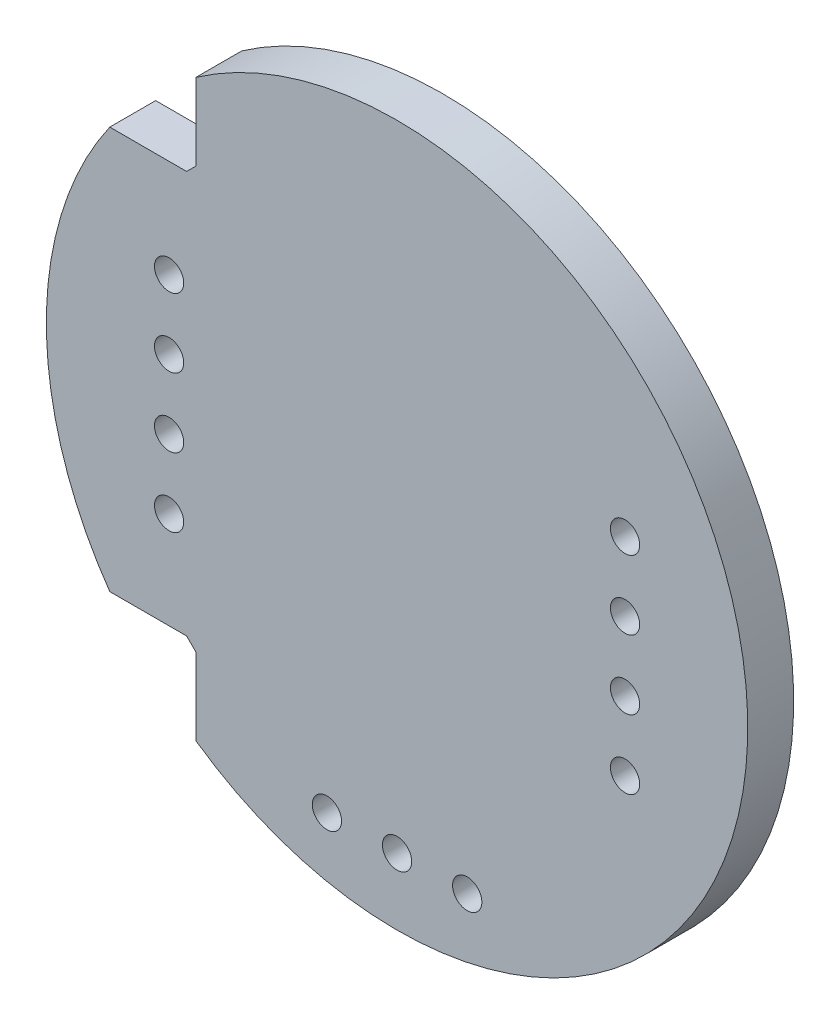
ISO-10303-21;
HEADER;
FILE_DESCRIPTION(('STEP AP214'),'2;1');
FILE_NAME('part.step','',(''),(''),'','','');
FILE_SCHEMA(('AUTOMOTIVE_DESIGN { 1 0 10303 214 1 1 1 1 }'));
ENDSEC;
DATA;
#1=APPLICATION_CONTEXT('core data for automotive mechanical design processes');
#2=APPLICATION_PROTOCOL_DEFINITION('international standard','automotive_design',2000,#1);
#3=PRODUCT_CONTEXT('',#1,'mechanical');
#4=PRODUCT('Part','Part','',(#3));
#5=PRODUCT_RELATED_PRODUCT_CATEGORY('part','',(#4));
#6=PRODUCT_DEFINITION_FORMATION('','',#4);
#7=PRODUCT_DEFINITION_CONTEXT('part definition',#1,'design');
#8=PRODUCT_DEFINITION('design','',#6,#7);
#9=PRODUCT_DEFINITION_SHAPE('','',#8);
#10=(LENGTH_UNIT() NAMED_UNIT(*) SI_UNIT(.MILLI.,.METRE.));
#11=(NAMED_UNIT(*) PLANE_ANGLE_UNIT() SI_UNIT($,.RADIAN.));
#12=(NAMED_UNIT(*) SI_UNIT($,.STERADIAN.) SOLID_ANGLE_UNIT());
#13=UNCERTAINTY_MEASURE_WITH_UNIT(LENGTH_MEASURE(1.E-05),#10,'distance_accuracy_value','');
#14=(GEOMETRIC_REPRESENTATION_CONTEXT(3) GLOBAL_UNCERTAINTY_ASSIGNED_CONTEXT((#13)) GLOBAL_UNIT_ASSIGNED_CONTEXT((#10,
#11,#12)) REPRESENTATION_CONTEXT('',''));
#15=CARTESIAN_POINT('',(0.,0.,0.));
#16=DIRECTION('',(0.,0.,1.));
#17=DIRECTION('',(1.,0.,0.));
#18=AXIS2_PLACEMENT_3D('',#15,#16,#17);
#19=CARTESIAN_POINT('',(17.780000686646,18.115999221802,0.));
#20=DIRECTION('',(0.707106781186548,0.707106781186548,0.));
#21=DIRECTION('',(-0.707106781186548,0.707106781186548,0.));
#22=AXIS2_PLACEMENT_3D('',#19,#20,#21);
#23=PLANE('',#22);
#24=DIRECTION('',(0.,0.,-1.));
#25=VECTOR('',#24,1.);
#26=CARTESIAN_POINT('',(18.115999221802,17.780000686646,0.));
#27=LINE('',#26,#25);
#28=CARTESIAN_POINT('',(18.115999221802,17.780000686646,0.));
#29=VERTEX_POINT('',#28);
#30=CARTESIAN_POINT('',(18.115999221802,17.780000686646,1.6614394));
#31=VERTEX_POINT('',#30);
#32=EDGE_CURVE('E92',#29,#31,#27,.F.);
#33=ORIENTED_EDGE('',*,*,#32,.T.);
#34=DIRECTION('',(0.707106781186548,-0.707106781186548,0.));
#35=VECTOR('',#34,1.);
#36=CARTESIAN_POINT('',(17.780000686646,18.115999221802,1.6614394));
#37=LINE('',#36,#35);
#38=CARTESIAN_POINT('',(17.780000686646,18.115999221802,1.6614394));
#39=VERTEX_POINT('',#38);
#40=EDGE_CURVE('E77',#39,#31,#37,.T.);
#41=ORIENTED_EDGE('',*,*,#40,.F.);
#42=DIRECTION('',(0.,0.,1.));
#43=VECTOR('',#42,1.);
#44=CARTESIAN_POINT('',(17.780000686646,18.115999221802,0.));
#45=LINE('',#44,#43);
#46=CARTESIAN_POINT('',(17.780000686646,18.115999221802,0.));
#47=VERTEX_POINT('',#46);
#48=EDGE_CURVE('E94',#39,#47,#45,.F.);
#49=ORIENTED_EDGE('',*,*,#48,.T.);
#50=DIRECTION('',(-0.707106781186548,0.707106781186548,0.));
#51=VECTOR('',#50,1.);
#52=CARTESIAN_POINT('',(17.780000686646,18.115999221802,0.));
#53=LINE('',#52,#51);
#54=EDGE_CURVE('E87',#29,#47,#53,.T.);
#55=ORIENTED_EDGE('',*,*,#54,.F.);
#56=EDGE_LOOP('',(#33,#41,#49,#55));
#57=FACE_BOUND('',#56,.T.);
#58=ADVANCED_FACE('F17',(#57),#23,.F.);
#59=CARTESIAN_POINT('',(18.115999221802,33.020000457764,0.));
#60=DIRECTION('',(0.707110795155155,-0.707102767195155,0.));
#61=DIRECTION('',(0.707102767195155,0.707110795155155,0.));
#62=AXIS2_PLACEMENT_3D('',#59,#60,#61);
#63=PLANE('',#62);
#64=DIRECTION('',(0.,0.,-1.));
#65=VECTOR('',#64,1.);
#66=CARTESIAN_POINT('',(17.780000686646,32.68399810791,0.));
#67=LINE('',#66,#65);
#68=CARTESIAN_POINT('',(17.7800006866458,32.6839981079102,0.));
#69=VERTEX_POINT('',#68);
#70=CARTESIAN_POINT('',(17.780000686646,32.68399810791,1.6614394));
#71=VERTEX_POINT('',#70);
#72=EDGE_CURVE('E132',#69,#71,#67,.F.);
#73=ORIENTED_EDGE('',*,*,#72,.T.);
#74=DIRECTION('',(-0.707102767194094,-0.707110795156215,0.));
#75=VECTOR('',#74,1.);
#76=CARTESIAN_POINT('',(18.115999221802,33.020000457764,1.6614394));
#77=LINE('',#76,#75);
#78=CARTESIAN_POINT('',(18.115999221802,33.020000457764,1.6614394));
#79=VERTEX_POINT('',#78);
#80=EDGE_CURVE('E158',#79,#71,#77,.T.);
#81=ORIENTED_EDGE('',*,*,#80,.F.);
#82=DIRECTION('',(0.,0.,-1.));
#83=VECTOR('',#82,1.);
#84=CARTESIAN_POINT('',(18.115999221802,33.020000457764,0.));
#85=LINE('',#84,#83);
#86=CARTESIAN_POINT('',(18.115999221802,33.020000457764,0.));
#87=VERTEX_POINT('',#86);
#88=EDGE_CURVE('E135',#79,#87,#85,.T.);
#89=ORIENTED_EDGE('',*,*,#88,.T.);
#90=DIRECTION('',(0.707102767195155,0.707110795155155,0.));
#91=VECTOR('',#90,1.);
#92=CARTESIAN_POINT('',(18.115999221802,33.020000457764,0.));
#93=LINE('',#92,#91);
#94=EDGE_CURVE('E96',#69,#87,#93,.T.);
#95=ORIENTED_EDGE('',*,*,#94,.F.);
#96=EDGE_LOOP('',(#73,#81,#89,#95));
#97=FACE_BOUND('',#96,.T.);
#98=ADVANCED_FACE('F441',(#97),#63,.F.);
#99=CARTESIAN_POINT('',(14.996999740601,18.115999221802,1.6614394));
#100=DIRECTION('',(0.,0.,1.));
#101=DIRECTION('',(1.,0.,0.));
#102=AXIS2_PLACEMENT_3D('',#99,#100,#101);
#103=PLANE('',#102);
#104=CARTESIAN_POINT('',(33.655,26.67,1.6614394));
#105=DIRECTION('',(0.,0.,-1.));
#106=DIRECTION('',(-1.,0.,0.));
#107=AXIS2_PLACEMENT_3D('',#104,#105,#106);
#108=CIRCLE('',#107,0.53);
#109=CARTESIAN_POINT('',(33.125,26.67,1.6614394));
#110=VERTEX_POINT('',#109);
#111=EDGE_CURVE('E115',#110,#110,#108,.T.);
#112=ORIENTED_EDGE('',*,*,#111,.T.);
#113=EDGE_LOOP('',(#112));
#114=FACE_BOUND('',#113,.T.);
#115=CARTESIAN_POINT('',(33.655,24.17,1.6614394));
#116=DIRECTION('',(0.,0.,-1.));
#117=DIRECTION('',(-1.,0.,0.));
#118=AXIS2_PLACEMENT_3D('',#115,#116,#117);
#119=CIRCLE('',#118,0.53);
#120=CARTESIAN_POINT('',(33.125,24.17,1.6614394));
#121=VERTEX_POINT('',#120);
#122=EDGE_CURVE('E213',#121,#121,#119,.T.);
#123=ORIENTED_EDGE('',*,*,#122,.T.);
#124=EDGE_LOOP('',(#123));
#125=FACE_BOUND('',#124,.T.);
#126=CARTESIAN_POINT('',(33.655,29.17,1.6614394));
#127=DIRECTION('',(0.,0.,-1.));
#128=DIRECTION('',(-1.,0.,0.));
#129=AXIS2_PLACEMENT_3D('',#126,#127,#128);
#130=CIRCLE('',#129,0.53);
#131=CARTESIAN_POINT('',(33.125,29.17,1.6614394));
#132=VERTEX_POINT('',#131);
#133=EDGE_CURVE('E216',#132,#132,#130,.T.);
#134=ORIENTED_EDGE('',*,*,#133,.T.);
#135=EDGE_LOOP('',(#134));
#136=FACE_BOUND('',#135,.T.);
#137=CARTESIAN_POINT('',(33.655,21.67,1.6614394));
#138=DIRECTION('',(0.,0.,-1.));
#139=DIRECTION('',(-1.,0.,0.));
#140=AXIS2_PLACEMENT_3D('',#137,#138,#139);
#141=CIRCLE('',#140,0.53);
#142=CARTESIAN_POINT('',(33.125,21.67,1.6614394));
#143=VERTEX_POINT('',#142);
#144=EDGE_CURVE('E219',#143,#143,#141,.T.);
#145=ORIENTED_EDGE('',*,*,#144,.T.);
#146=EDGE_LOOP('',(#145));
#147=FACE_BOUND('',#146,.T.);
#148=CARTESIAN_POINT('',(27.94,15.113,1.6614394));
#149=DIRECTION('',(0.,0.,-1.));
#150=DIRECTION('',(-1.,0.,0.));
#151=AXIS2_PLACEMENT_3D('',#148,#149,#150);
#152=CIRCLE('',#151,0.53);
#153=CARTESIAN_POINT('',(27.41,15.113,1.6614394));
#154=VERTEX_POINT('',#153);
#155=EDGE_CURVE('E222',#154,#154,#152,.T.);
#156=ORIENTED_EDGE('',*,*,#155,.T.);
#157=EDGE_LOOP('',(#156));
#158=FACE_BOUND('',#157,.T.);
#159=CARTESIAN_POINT('',(25.4,15.113,1.6614394));
#160=DIRECTION('',(0.,0.,-1.));
#161=DIRECTION('',(-1.,0.,0.));
#162=AXIS2_PLACEMENT_3D('',#159,#160,#161);
#163=CIRCLE('',#162,0.53);
#164=CARTESIAN_POINT('',(24.87,15.113,1.6614394));
#165=VERTEX_POINT('',#164);
#166=EDGE_CURVE('E225',#165,#165,#163,.T.);
#167=ORIENTED_EDGE('',*,*,#166,.T.);
#168=EDGE_LOOP('',(#167));
#169=FACE_BOUND('',#168,.T.);
#170=CARTESIAN_POINT('',(17.145,26.63,1.6614394));
#171=DIRECTION('',(0.,0.,-1.));
#172=DIRECTION('',(-1.,0.,0.));
#173=AXIS2_PLACEMENT_3D('',#170,#171,#172);
#174=CIRCLE('',#173,0.53);
#175=CARTESIAN_POINT('',(16.615,26.63,1.6614394));
#176=VERTEX_POINT('',#175);
#177=EDGE_CURVE('E228',#176,#176,#174,.T.);
#178=ORIENTED_EDGE('',*,*,#177,.T.);
#179=EDGE_LOOP('',(#178));
#180=FACE_BOUND('',#179,.T.);
#181=CARTESIAN_POINT('',(17.145,24.13,1.6614394));
#182=DIRECTION('',(0.,0.,-1.));
#183=DIRECTION('',(-1.,0.,0.));
#184=AXIS2_PLACEMENT_3D('',#181,#182,#183);
#185=CIRCLE('',#184,0.53);
#186=CARTESIAN_POINT('',(16.615,24.13,1.6614394));
#187=VERTEX_POINT('',#186);
#188=EDGE_CURVE('E231',#187,#187,#185,.T.);
#189=ORIENTED_EDGE('',*,*,#188,.T.);
#190=EDGE_LOOP('',(#189));
#191=FACE_BOUND('',#190,.T.);
#192=CARTESIAN_POINT('',(17.145,29.13,1.6614394));
#193=DIRECTION('',(0.,0.,-1.));
#194=DIRECTION('',(-1.,0.,0.));
#195=AXIS2_PLACEMENT_3D('',#192,#193,#194);
#196=CIRCLE('',#195,0.53);
#197=CARTESIAN_POINT('',(16.615,29.13,1.6614394));
#198=VERTEX_POINT('',#197);
#199=EDGE_CURVE('E234',#198,#198,#196,.T.);
#200=ORIENTED_EDGE('',*,*,#199,.T.);
#201=EDGE_LOOP('',(#200));
#202=FACE_BOUND('',#201,.T.);
#203=CARTESIAN_POINT('',(22.86,15.113,1.6614394));
#204=DIRECTION('',(0.,0.,-1.));
#205=DIRECTION('',(-1.,0.,0.));
#206=AXIS2_PLACEMENT_3D('',#203,#204,#205);
#207=CIRCLE('',#206,0.53);
#208=CARTESIAN_POINT('',(22.33,15.113,1.6614394));
#209=VERTEX_POINT('',#208);
#210=EDGE_CURVE('E237',#209,#209,#207,.T.);
#211=ORIENTED_EDGE('',*,*,#210,.T.);
#212=EDGE_LOOP('',(#211));
#213=FACE_BOUND('',#212,.T.);
#214=CARTESIAN_POINT('',(17.145,21.63,1.6614394));
#215=DIRECTION('',(0.,0.,-1.));
#216=DIRECTION('',(-1.,0.,0.));
#217=AXIS2_PLACEMENT_3D('',#214,#215,#216);
#218=CIRCLE('',#217,0.53);
#219=CARTESIAN_POINT('',(16.615,21.63,1.6614394));
#220=VERTEX_POINT('',#219);
#221=EDGE_CURVE('E126',#220,#220,#218,.T.);
#222=ORIENTED_EDGE('',*,*,#221,.T.);
#223=EDGE_LOOP('',(#222));
#224=FACE_BOUND('',#223,.T.);
#225=DIRECTION('',(1.,0.,0.));
#226=VECTOR('',#225,1.);
#227=CARTESIAN_POINT('',(17.780000686646,32.68399810791,1.6614394));
#228=LINE('',#227,#226);
#229=CARTESIAN_POINT('',(14.9969997406005,32.6839981079101,1.6614394));
#230=VERTEX_POINT('',#229);
#231=EDGE_CURVE('E131',#71,#230,#228,.F.);
#232=ORIENTED_EDGE('',*,*,#231,.T.);
#233=CARTESIAN_POINT('',(25.397618075421,25.399998664856,1.6614394));
#234=DIRECTION('',(0.,0.,-1.));
#235=DIRECTION('',(-1.,0.,0.));
#236=AXIS2_PLACEMENT_3D('',#233,#234,#235);
#237=CIRCLE('',#236,12.697618266156);
#238=CARTESIAN_POINT('',(14.9969997406005,18.1159992218018,1.6614394));
#239=VERTEX_POINT('',#238);
#240=EDGE_CURVE('E127',#239,#230,#237,.T.);
#241=ORIENTED_EDGE('',*,*,#240,.F.);
#242=DIRECTION('',(1.,0.,0.));
#243=VECTOR('',#242,1.);
#244=CARTESIAN_POINT('',(14.996999740601,18.115999221802,1.6614394));
#245=LINE('',#244,#243);
#246=EDGE_CURVE('E150',#239,#39,#245,.T.);
#247=ORIENTED_EDGE('',*,*,#246,.T.);
#248=ORIENTED_EDGE('',*,*,#40,.T.);
#249=DIRECTION('',(0.,1.,0.));
#250=VECTOR('',#249,1.);
#251=CARTESIAN_POINT('',(18.115999221802,17.780000686646,1.6614394));
#252=LINE('',#251,#250);
#253=CARTESIAN_POINT('',(18.1159992218019,14.9969997406006,1.6614394));
#254=VERTEX_POINT('',#253);
#255=EDGE_CURVE('E103',#31,#254,#252,.F.);
#256=ORIENTED_EDGE('',*,*,#255,.T.);
#257=CARTESIAN_POINT('',(25.400271907625,25.400000572205,1.6614394));
#258=DIRECTION('',(0.,0.,-1.));
#259=DIRECTION('',(-1.,0.,0.));
#260=AXIS2_PLACEMENT_3D('',#257,#258,#259);
#261=CIRCLE('',#260,12.699726566497);
#262=CARTESIAN_POINT('',(18.115999221802,35.8030014038092,1.6614394));
#263=VERTEX_POINT('',#262);
#264=EDGE_CURVE('E20',#263,#254,#261,.T.);
#265=ORIENTED_EDGE('',*,*,#264,.F.);
#266=DIRECTION('',(0.,1.,0.));
#267=VECTOR('',#266,1.);
#268=CARTESIAN_POINT('',(18.115999221802,35.803001403809,1.6614394));
#269=LINE('',#268,#267);
#270=EDGE_CURVE('E140',#263,#79,#269,.F.);
#271=ORIENTED_EDGE('',*,*,#270,.T.);
#272=ORIENTED_EDGE('',*,*,#80,.T.);
#273=EDGE_LOOP('',(#232,#241,#247,#248,#256,#265,#271,#272));
#274=FACE_BOUND('',#273,.T.);
#275=ADVANCED_FACE('F245',(#114,#125,#136,#147,#158,#169,#180,#191,#202,#213,#224,#274),#103,.T.);
#276=CARTESIAN_POINT('',(14.996999740601,18.115999221802,0.));
#277=DIRECTION('',(0.,1.,0.));
#278=DIRECTION('',(0.,0.,1.));
#279=AXIS2_PLACEMENT_3D('',#276,#277,#278);
#280=PLANE('',#279);
#281=ORIENTED_EDGE('',*,*,#48,.F.);
#282=ORIENTED_EDGE('',*,*,#246,.F.);
#283=DIRECTION('',(0.,0.,-1.));
#284=VECTOR('',#283,1.);
#285=CARTESIAN_POINT('',(14.9969997406006,18.1159992218017,0.));
#286=LINE('',#285,#284);
#287=CARTESIAN_POINT('',(14.9969997406005,18.1159992218018,0.));
#288=VERTEX_POINT('',#287);
#289=EDGE_CURVE('E128',#288,#239,#286,.F.);
#290=ORIENTED_EDGE('',*,*,#289,.F.);
#291=DIRECTION('',(1.,0.,0.));
#292=VECTOR('',#291,1.);
#293=CARTESIAN_POINT('',(14.996999740601,18.115999221802,0.));
#294=LINE('',#293,#292);
#295=EDGE_CURVE('E111',#288,#47,#294,.T.);
#296=ORIENTED_EDGE('',*,*,#295,.T.);
#297=EDGE_LOOP('',(#281,#282,#290,#296));
#298=FACE_BOUND('',#297,.T.);
#299=ADVANCED_FACE('F266',(#298),#280,.F.);
#300=CARTESIAN_POINT('',(18.115999221802,17.780000686646,0.));
#301=DIRECTION('',(1.,0.,0.));
#302=DIRECTION('',(0.,0.,-1.));
#303=AXIS2_PLACEMENT_3D('',#300,#301,#302);
#304=PLANE('',#303);
#305=DIRECTION('',(0.,0.,-1.));
#306=VECTOR('',#305,1.);
#307=CARTESIAN_POINT('',(18.1159992218018,14.9969997406007,0.));
#308=LINE('',#307,#306);
#309=CARTESIAN_POINT('',(18.1159992218019,14.9969997406006,0.));
#310=VERTEX_POINT('',#309);
#311=EDGE_CURVE('E141',#254,#310,#308,.T.);
#312=ORIENTED_EDGE('',*,*,#311,.F.);
#313=ORIENTED_EDGE('',*,*,#255,.F.);
#314=ORIENTED_EDGE('',*,*,#32,.F.);
#315=DIRECTION('',(0.,1.,0.));
#316=VECTOR('',#315,1.);
#317=CARTESIAN_POINT('',(18.115999221802,18.115999221802,0.));
#318=LINE('',#317,#316);
#319=EDGE_CURVE('E102',#29,#310,#318,.F.);
#320=ORIENTED_EDGE('',*,*,#319,.T.);
#321=EDGE_LOOP('',(#312,#313,#314,#320));
#322=FACE_BOUND('',#321,.T.);
#323=ADVANCED_FACE('F101',(#322),#304,.F.);
#324=CARTESIAN_POINT('',(25.400271907625,25.400000572205,0.));
#325=DIRECTION('',(0.,0.,-1.));
#326=DIRECTION('',(-1.,0.,0.));
#327=AXIS2_PLACEMENT_3D('',#324,#325,#326);
#328=CYLINDRICAL_SURFACE('',#327,12.699726566497);
#329=ORIENTED_EDGE('',*,*,#264,.T.);
#330=ORIENTED_EDGE('',*,*,#311,.T.);
#331=CARTESIAN_POINT('',(25.400271907625,25.400000572205,0.));
#332=DIRECTION('',(0.,0.,-1.));
#333=DIRECTION('',(-1.,0.,0.));
#334=AXIS2_PLACEMENT_3D('',#331,#332,#333);
#335=CIRCLE('',#334,12.699726566497);
#336=CARTESIAN_POINT('',(18.115999221802,35.8030014038092,0.));
#337=VERTEX_POINT('',#336);
#338=EDGE_CURVE('E110',#310,#337,#335,.F.);
#339=ORIENTED_EDGE('',*,*,#338,.T.);
#340=DIRECTION('',(0.,0.,-1.));
#341=VECTOR('',#340,1.);
#342=CARTESIAN_POINT('',(18.115999221802,35.803001403809,0.));
#343=LINE('',#342,#341);
#344=EDGE_CURVE('E138',#337,#263,#343,.F.);
#345=ORIENTED_EDGE('',*,*,#344,.T.);
#346=EDGE_LOOP('',(#329,#330,#339,#345));
#347=FACE_BOUND('',#346,.T.);
#348=ADVANCED_FACE('F257',(#347),#328,.T.);
#349=CARTESIAN_POINT('',(18.115999221802,35.803001403809,0.));
#350=DIRECTION('',(1.,0.,0.));
#351=DIRECTION('',(0.,0.,-1.));
#352=AXIS2_PLACEMENT_3D('',#349,#350,#351);
#353=PLANE('',#352);
#354=ORIENTED_EDGE('',*,*,#88,.F.);
#355=ORIENTED_EDGE('',*,*,#270,.F.);
#356=ORIENTED_EDGE('',*,*,#344,.F.);
#357=DIRECTION('',(0.,1.,0.));
#358=VECTOR('',#357,1.);
#359=CARTESIAN_POINT('',(18.115999221802,18.115999221802,0.));
#360=LINE('',#359,#358);
#361=EDGE_CURVE('E113',#337,#87,#360,.F.);
#362=ORIENTED_EDGE('',*,*,#361,.T.);
#363=EDGE_LOOP('',(#354,#355,#356,#362));
#364=FACE_BOUND('',#363,.T.);
#365=ADVANCED_FACE('F256',(#364),#353,.F.);
#366=CARTESIAN_POINT('',(17.780000686646,32.68399810791,0.));
#367=DIRECTION('',(0.,-1.,0.));
#368=DIRECTION('',(0.,0.,-1.));
#369=AXIS2_PLACEMENT_3D('',#366,#367,#368);
#370=PLANE('',#369);
#371=DIRECTION('',(0.,0.,-1.));
#372=VECTOR('',#371,1.);
#373=CARTESIAN_POINT('',(14.9969997406006,32.6839981079103,0.));
#374=LINE('',#373,#372);
#375=CARTESIAN_POINT('',(14.9969997406005,32.6839981079101,0.));
#376=VERTEX_POINT('',#375);
#377=EDGE_CURVE('E35',#230,#376,#374,.T.);
#378=ORIENTED_EDGE('',*,*,#377,.F.);
#379=ORIENTED_EDGE('',*,*,#231,.F.);
#380=ORIENTED_EDGE('',*,*,#72,.F.);
#381=DIRECTION('',(1.,0.,0.));
#382=VECTOR('',#381,1.);
#383=CARTESIAN_POINT('',(14.996999740601,32.68399810791,0.));
#384=LINE('',#383,#382);
#385=EDGE_CURVE('E209',#69,#376,#384,.F.);
#386=ORIENTED_EDGE('',*,*,#385,.T.);
#387=EDGE_LOOP('',(#378,#379,#380,#386));
#388=FACE_BOUND('',#387,.T.);
#389=ADVANCED_FACE('F249',(#388),#370,.F.);
#390=CARTESIAN_POINT('',(25.397618075421,25.399998664856,0.));
#391=DIRECTION('',(0.,0.,-1.));
#392=DIRECTION('',(-1.,0.,0.));
#393=AXIS2_PLACEMENT_3D('',#390,#391,#392);
#394=CYLINDRICAL_SURFACE('',#393,12.697618266156);
#395=ORIENTED_EDGE('',*,*,#240,.T.);
#396=ORIENTED_EDGE('',*,*,#377,.T.);
#397=CARTESIAN_POINT('',(25.397618075421,25.399998664856,0.));
#398=DIRECTION('',(0.,0.,-1.));
#399=DIRECTION('',(-1.,0.,0.));
#400=AXIS2_PLACEMENT_3D('',#397,#398,#399);
#401=CIRCLE('',#400,12.697618266156);
#402=EDGE_CURVE('E208',#376,#288,#401,.F.);
#403=ORIENTED_EDGE('',*,*,#402,.T.);
#404=ORIENTED_EDGE('',*,*,#289,.T.);
#405=EDGE_LOOP('',(#395,#396,#403,#404));
#406=FACE_BOUND('',#405,.T.);
#407=ADVANCED_FACE('F242',(#406),#394,.T.);
#408=CARTESIAN_POINT('',(17.145,21.63,0.));
#409=DIRECTION('',(0.,0.,-1.));
#410=DIRECTION('',(-1.,0.,0.));
#411=AXIS2_PLACEMENT_3D('',#408,#409,#410);
#412=CYLINDRICAL_SURFACE('',#411,0.53);
#413=ORIENTED_EDGE('',*,*,#221,.F.);
#414=EDGE_LOOP('',(#413));
#415=FACE_BOUND('',#414,.T.);
#416=CARTESIAN_POINT('',(17.145,21.63,0.));
#417=DIRECTION('',(0.,0.,-1.));
#418=DIRECTION('',(-1.,0.,0.));
#419=AXIS2_PLACEMENT_3D('',#416,#417,#418);
#420=CIRCLE('',#419,0.53);
#421=CARTESIAN_POINT('',(16.615,21.63,0.));
#422=VERTEX_POINT('',#421);
#423=EDGE_CURVE('E205',#422,#422,#420,.T.);
#424=ORIENTED_EDGE('',*,*,#423,.T.);
#425=EDGE_LOOP('',(#424));
#426=FACE_BOUND('',#425,.T.);
#427=ADVANCED_FACE('F315',(#415,#426),#412,.F.);
#428=CARTESIAN_POINT('',(22.86,15.113,0.));
#429=DIRECTION('',(0.,0.,-1.));
#430=DIRECTION('',(-1.,0.,0.));
#431=AXIS2_PLACEMENT_3D('',#428,#429,#430);
#432=CYLINDRICAL_SURFACE('',#431,0.53);
#433=ORIENTED_EDGE('',*,*,#210,.F.);
#434=EDGE_LOOP('',(#433));
#435=FACE_BOUND('',#434,.T.);
#436=CARTESIAN_POINT('',(22.86,15.113,0.));
#437=DIRECTION('',(0.,0.,-1.));
#438=DIRECTION('',(-1.,0.,0.));
#439=AXIS2_PLACEMENT_3D('',#436,#437,#438);
#440=CIRCLE('',#439,0.53);
#441=CARTESIAN_POINT('',(22.33,15.113,0.));
#442=VERTEX_POINT('',#441);
#443=EDGE_CURVE('E202',#442,#442,#440,.T.);
#444=ORIENTED_EDGE('',*,*,#443,.T.);
#445=EDGE_LOOP('',(#444));
#446=FACE_BOUND('',#445,.T.);
#447=ADVANCED_FACE('F311',(#435,#446),#432,.F.);
#448=CARTESIAN_POINT('',(17.145,29.13,0.));
#449=DIRECTION('',(0.,0.,-1.));
#450=DIRECTION('',(-1.,0.,0.));
#451=AXIS2_PLACEMENT_3D('',#448,#449,#450);
#452=CYLINDRICAL_SURFACE('',#451,0.53);
#453=ORIENTED_EDGE('',*,*,#199,.F.);
#454=EDGE_LOOP('',(#453));
#455=FACE_BOUND('',#454,.T.);
#456=CARTESIAN_POINT('',(17.145,29.13,0.));
#457=DIRECTION('',(0.,0.,-1.));
#458=DIRECTION('',(-1.,0.,0.));
#459=AXIS2_PLACEMENT_3D('',#456,#457,#458);
#460=CIRCLE('',#459,0.53);
#461=CARTESIAN_POINT('',(16.615,29.13,0.));
#462=VERTEX_POINT('',#461);
#463=EDGE_CURVE('E199',#462,#462,#460,.T.);
#464=ORIENTED_EDGE('',*,*,#463,.T.);
#465=EDGE_LOOP('',(#464));
#466=FACE_BOUND('',#465,.T.);
#467=ADVANCED_FACE('F307',(#455,#466),#452,.F.);
#468=CARTESIAN_POINT('',(17.145,24.13,0.));
#469=DIRECTION('',(0.,0.,-1.));
#470=DIRECTION('',(-1.,0.,0.));
#471=AXIS2_PLACEMENT_3D('',#468,#469,#470);
#472=CYLINDRICAL_SURFACE('',#471,0.53);
#473=ORIENTED_EDGE('',*,*,#188,.F.);
#474=EDGE_LOOP('',(#473));
#475=FACE_BOUND('',#474,.T.);
#476=CARTESIAN_POINT('',(17.145,24.13,0.));
#477=DIRECTION('',(0.,0.,-1.));
#478=DIRECTION('',(-1.,0.,0.));
#479=AXIS2_PLACEMENT_3D('',#476,#477,#478);
#480=CIRCLE('',#479,0.53);
#481=CARTESIAN_POINT('',(16.615,24.13,0.));
#482=VERTEX_POINT('',#481);
#483=EDGE_CURVE('E196',#482,#482,#480,.T.);
#484=ORIENTED_EDGE('',*,*,#483,.T.);
#485=EDGE_LOOP('',(#484));
#486=FACE_BOUND('',#485,.T.);
#487=ADVANCED_FACE('F303',(#475,#486),#472,.F.);
#488=CARTESIAN_POINT('',(17.145,26.63,0.));
#489=DIRECTION('',(0.,0.,-1.));
#490=DIRECTION('',(-1.,0.,0.));
#491=AXIS2_PLACEMENT_3D('',#488,#489,#490);
#492=CYLINDRICAL_SURFACE('',#491,0.53);
#493=ORIENTED_EDGE('',*,*,#177,.F.);
#494=EDGE_LOOP('',(#493));
#495=FACE_BOUND('',#494,.T.);
#496=CARTESIAN_POINT('',(17.145,26.63,0.));
#497=DIRECTION('',(0.,0.,-1.));
#498=DIRECTION('',(-1.,0.,0.));
#499=AXIS2_PLACEMENT_3D('',#496,#497,#498);
#500=CIRCLE('',#499,0.53);
#501=CARTESIAN_POINT('',(16.615,26.63,0.));
#502=VERTEX_POINT('',#501);
#503=EDGE_CURVE('E193',#502,#502,#500,.T.);
#504=ORIENTED_EDGE('',*,*,#503,.T.);
#505=EDGE_LOOP('',(#504));
#506=FACE_BOUND('',#505,.T.);
#507=ADVANCED_FACE('F299',(#495,#506),#492,.F.);
#508=CARTESIAN_POINT('',(25.4,15.113,0.));
#509=DIRECTION('',(0.,0.,-1.));
#510=DIRECTION('',(-1.,0.,0.));
#511=AXIS2_PLACEMENT_3D('',#508,#509,#510);
#512=CYLINDRICAL_SURFACE('',#511,0.53);
#513=ORIENTED_EDGE('',*,*,#166,.F.);
#514=EDGE_LOOP('',(#513));
#515=FACE_BOUND('',#514,.T.);
#516=CARTESIAN_POINT('',(25.4,15.113,0.));
#517=DIRECTION('',(0.,0.,-1.));
#518=DIRECTION('',(-1.,0.,0.));
#519=AXIS2_PLACEMENT_3D('',#516,#517,#518);
#520=CIRCLE('',#519,0.53);
#521=CARTESIAN_POINT('',(24.87,15.113,0.));
#522=VERTEX_POINT('',#521);
#523=EDGE_CURVE('E190',#522,#522,#520,.T.);
#524=ORIENTED_EDGE('',*,*,#523,.T.);
#525=EDGE_LOOP('',(#524));
#526=FACE_BOUND('',#525,.T.);
#527=ADVANCED_FACE('F295',(#515,#526),#512,.F.);
#528=CARTESIAN_POINT('',(27.94,15.113,0.));
#529=DIRECTION('',(0.,0.,-1.));
#530=DIRECTION('',(-1.,0.,0.));
#531=AXIS2_PLACEMENT_3D('',#528,#529,#530);
#532=CYLINDRICAL_SURFACE('',#531,0.53);
#533=ORIENTED_EDGE('',*,*,#155,.F.);
#534=EDGE_LOOP('',(#533));
#535=FACE_BOUND('',#534,.T.);
#536=CARTESIAN_POINT('',(27.94,15.113,0.));
#537=DIRECTION('',(0.,0.,-1.));
#538=DIRECTION('',(-1.,0.,0.));
#539=AXIS2_PLACEMENT_3D('',#536,#537,#538);
#540=CIRCLE('',#539,0.53);
#541=CARTESIAN_POINT('',(27.41,15.113,0.));
#542=VERTEX_POINT('',#541);
#543=EDGE_CURVE('E187',#542,#542,#540,.T.);
#544=ORIENTED_EDGE('',*,*,#543,.T.);
#545=EDGE_LOOP('',(#544));
#546=FACE_BOUND('',#545,.T.);
#547=ADVANCED_FACE('F291',(#535,#546),#532,.F.);
#548=CARTESIAN_POINT('',(33.655,21.67,0.));
#549=DIRECTION('',(0.,0.,-1.));
#550=DIRECTION('',(-1.,0.,0.));
#551=AXIS2_PLACEMENT_3D('',#548,#549,#550);
#552=CYLINDRICAL_SURFACE('',#551,0.53);
#553=ORIENTED_EDGE('',*,*,#144,.F.);
#554=EDGE_LOOP('',(#553));
#555=FACE_BOUND('',#554,.T.);
#556=CARTESIAN_POINT('',(33.655,21.67,0.));
#557=DIRECTION('',(0.,0.,-1.));
#558=DIRECTION('',(-1.,0.,0.));
#559=AXIS2_PLACEMENT_3D('',#556,#557,#558);
#560=CIRCLE('',#559,0.53);
#561=CARTESIAN_POINT('',(33.125,21.67,0.));
#562=VERTEX_POINT('',#561);
#563=EDGE_CURVE('E184',#562,#562,#560,.T.);
#564=ORIENTED_EDGE('',*,*,#563,.T.);
#565=EDGE_LOOP('',(#564));
#566=FACE_BOUND('',#565,.T.);
#567=ADVANCED_FACE('F287',(#555,#566),#552,.F.);
#568=CARTESIAN_POINT('',(33.655,29.17,0.));
#569=DIRECTION('',(0.,0.,-1.));
#570=DIRECTION('',(-1.,0.,0.));
#571=AXIS2_PLACEMENT_3D('',#568,#569,#570);
#572=CYLINDRICAL_SURFACE('',#571,0.53);
#573=ORIENTED_EDGE('',*,*,#133,.F.);
#574=EDGE_LOOP('',(#573));
#575=FACE_BOUND('',#574,.T.);
#576=CARTESIAN_POINT('',(33.655,29.17,0.));
#577=DIRECTION('',(0.,0.,-1.));
#578=DIRECTION('',(-1.,0.,0.));
#579=AXIS2_PLACEMENT_3D('',#576,#577,#578);
#580=CIRCLE('',#579,0.53);
#581=CARTESIAN_POINT('',(33.125,29.17,0.));
#582=VERTEX_POINT('',#581);
#583=EDGE_CURVE('E181',#582,#582,#580,.T.);
#584=ORIENTED_EDGE('',*,*,#583,.T.);
#585=EDGE_LOOP('',(#584));
#586=FACE_BOUND('',#585,.T.);
#587=ADVANCED_FACE('F283',(#575,#586),#572,.F.);
#588=CARTESIAN_POINT('',(33.655,24.17,0.));
#589=DIRECTION('',(0.,0.,-1.));
#590=DIRECTION('',(-1.,0.,0.));
#591=AXIS2_PLACEMENT_3D('',#588,#589,#590);
#592=CYLINDRICAL_SURFACE('',#591,0.53);
#593=ORIENTED_EDGE('',*,*,#122,.F.);
#594=EDGE_LOOP('',(#593));
#595=FACE_BOUND('',#594,.T.);
#596=CARTESIAN_POINT('',(33.655,24.17,0.));
#597=DIRECTION('',(0.,0.,-1.));
#598=DIRECTION('',(-1.,0.,0.));
#599=AXIS2_PLACEMENT_3D('',#596,#597,#598);
#600=CIRCLE('',#599,0.53);
#601=CARTESIAN_POINT('',(33.125,24.17,0.));
#602=VERTEX_POINT('',#601);
#603=EDGE_CURVE('E26',#602,#602,#600,.T.);
#604=ORIENTED_EDGE('',*,*,#603,.T.);
#605=EDGE_LOOP('',(#604));
#606=FACE_BOUND('',#605,.T.);
#607=ADVANCED_FACE('F275',(#595,#606),#592,.F.);
#608=CARTESIAN_POINT('',(33.655,26.67,0.));
#609=DIRECTION('',(0.,0.,-1.));
#610=DIRECTION('',(-1.,0.,0.));
#611=AXIS2_PLACEMENT_3D('',#608,#609,#610);
#612=CYLINDRICAL_SURFACE('',#611,0.53);
#613=ORIENTED_EDGE('',*,*,#111,.F.);
#614=EDGE_LOOP('',(#613));
#615=FACE_BOUND('',#614,.T.);
#616=CARTESIAN_POINT('',(33.655,26.67,0.));
#617=DIRECTION('',(0.,0.,-1.));
#618=DIRECTION('',(-1.,0.,0.));
#619=AXIS2_PLACEMENT_3D('',#616,#617,#618);
#620=CIRCLE('',#619,0.53);
#621=CARTESIAN_POINT('',(33.125,26.67,0.));
#622=VERTEX_POINT('',#621);
#623=EDGE_CURVE('E11',#622,#622,#620,.T.);
#624=ORIENTED_EDGE('',*,*,#623,.T.);
#625=EDGE_LOOP('',(#624));
#626=FACE_BOUND('',#625,.T.);
#627=ADVANCED_FACE('F269',(#615,#626),#612,.F.);
#628=CARTESIAN_POINT('',(14.996999740601,18.115999221802,0.));
#629=DIRECTION('',(0.,0.,1.));
#630=DIRECTION('',(1.,0.,0.));
#631=AXIS2_PLACEMENT_3D('',#628,#629,#630);
#632=PLANE('',#631);
#633=ORIENTED_EDGE('',*,*,#623,.F.);
#634=EDGE_LOOP('',(#633));
#635=FACE_BOUND('',#634,.T.);
#636=ORIENTED_EDGE('',*,*,#603,.F.);
#637=EDGE_LOOP('',(#636));
#638=FACE_BOUND('',#637,.T.);
#639=ORIENTED_EDGE('',*,*,#583,.F.);
#640=EDGE_LOOP('',(#639));
#641=FACE_BOUND('',#640,.T.);
#642=ORIENTED_EDGE('',*,*,#563,.F.);
#643=EDGE_LOOP('',(#642));
#644=FACE_BOUND('',#643,.T.);
#645=ORIENTED_EDGE('',*,*,#543,.F.);
#646=EDGE_LOOP('',(#645));
#647=FACE_BOUND('',#646,.T.);
#648=ORIENTED_EDGE('',*,*,#523,.F.);
#649=EDGE_LOOP('',(#648));
#650=FACE_BOUND('',#649,.T.);
#651=ORIENTED_EDGE('',*,*,#503,.F.);
#652=EDGE_LOOP('',(#651));
#653=FACE_BOUND('',#652,.T.);
#654=ORIENTED_EDGE('',*,*,#483,.F.);
#655=EDGE_LOOP('',(#654));
#656=FACE_BOUND('',#655,.T.);
#657=ORIENTED_EDGE('',*,*,#463,.F.);
#658=EDGE_LOOP('',(#657));
#659=FACE_BOUND('',#658,.T.);
#660=ORIENTED_EDGE('',*,*,#443,.F.);
#661=EDGE_LOOP('',(#660));
#662=FACE_BOUND('',#661,.T.);
#663=ORIENTED_EDGE('',*,*,#423,.F.);
#664=EDGE_LOOP('',(#663));
#665=FACE_BOUND('',#664,.T.);
#666=ORIENTED_EDGE('',*,*,#385,.F.);
#667=ORIENTED_EDGE('',*,*,#94,.T.);
#668=ORIENTED_EDGE('',*,*,#361,.F.);
#669=ORIENTED_EDGE('',*,*,#338,.F.);
#670=ORIENTED_EDGE('',*,*,#319,.F.);
#671=ORIENTED_EDGE('',*,*,#54,.T.);
#672=ORIENTED_EDGE('',*,*,#295,.F.);
#673=ORIENTED_EDGE('',*,*,#402,.F.);
#674=EDGE_LOOP('',(#666,#667,#668,#669,#670,#671,#672,#673));
#675=FACE_BOUND('',#674,.T.);
#676=ADVANCED_FACE('F107',(#635,#638,#641,#644,#647,#650,#653,#656,#659,#662,#665,#675),#632,.F.);
#677=CLOSED_SHELL('',(#58,#98,#275,#299,#323,#348,#365,#389,#407,#427,#447,#467,#487,#507,#527,
#547,#567,#587,#607,#627,#676));
#678=MANIFOLD_SOLID_BREP('B1',#677);
#679=ADVANCED_BREP_SHAPE_REPRESENTATION('',(#18,#678),#14);
#680=SHAPE_DEFINITION_REPRESENTATION(#9,#679);
ENDSEC;
END-ISO-10303-21;
